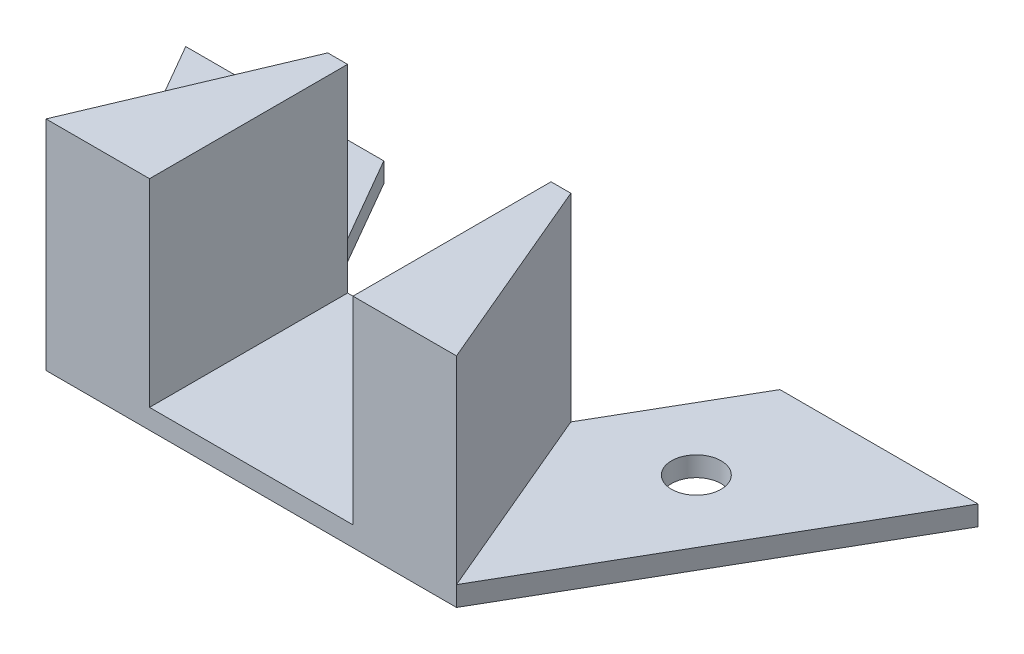
ISO-10303-21;
HEADER;
FILE_DESCRIPTION(('STEP AP214'),'2;1');
FILE_NAME('part.step','',(''),(''),'','','');
FILE_SCHEMA(('AUTOMOTIVE_DESIGN { 1 0 10303 214 1 1 1 1 }'));
ENDSEC;
DATA;
#1=APPLICATION_CONTEXT('core data for automotive mechanical design processes');
#2=APPLICATION_PROTOCOL_DEFINITION('international standard','automotive_design',2000,#1);
#3=PRODUCT_CONTEXT('',#1,'mechanical');
#4=PRODUCT('Part','Part','',(#3));
#5=PRODUCT_RELATED_PRODUCT_CATEGORY('part','',(#4));
#6=PRODUCT_DEFINITION_FORMATION('','',#4);
#7=PRODUCT_DEFINITION_CONTEXT('part definition',#1,'design');
#8=PRODUCT_DEFINITION('design','',#6,#7);
#9=PRODUCT_DEFINITION_SHAPE('','',#8);
#10=(LENGTH_UNIT() NAMED_UNIT(*) SI_UNIT(.MILLI.,.METRE.));
#11=(NAMED_UNIT(*) PLANE_ANGLE_UNIT() SI_UNIT($,.RADIAN.));
#12=(NAMED_UNIT(*) SI_UNIT($,.STERADIAN.) SOLID_ANGLE_UNIT());
#13=UNCERTAINTY_MEASURE_WITH_UNIT(LENGTH_MEASURE(1.E-05),#10,'distance_accuracy_value','');
#14=(GEOMETRIC_REPRESENTATION_CONTEXT(3) GLOBAL_UNCERTAINTY_ASSIGNED_CONTEXT((#13)) GLOBAL_UNIT_ASSIGNED_CONTEXT((#10,
#11,#12)) REPRESENTATION_CONTEXT('',''));
#15=CARTESIAN_POINT('',(0.,0.,0.));
#16=DIRECTION('',(0.,0.,1.));
#17=DIRECTION('',(1.,0.,0.));
#18=AXIS2_PLACEMENT_3D('',#15,#16,#17);
#19=CARTESIAN_POINT('',(0.,2.54,0.));
#20=DIRECTION('',(0.,1.,0.));
#21=DIRECTION('',(0.,0.,1.));
#22=AXIS2_PLACEMENT_3D('',#19,#20,#21);
#23=PLANE('',#22);
#24=DIRECTION('',(-1.,0.,0.));
#25=VECTOR('',#24,1.);
#26=CARTESIAN_POINT('',(0.,2.54,42.4));
#27=LINE('',#26,#25);
#28=CARTESIAN_POINT('',(13.0450454237764,2.54,42.4));
#29=VERTEX_POINT('',#28);
#30=CARTESIAN_POINT('',(-13.0450454237764,2.54,42.4));
#31=VERTEX_POINT('',#30);
#32=EDGE_CURVE('E52',#29,#31,#27,.T.);
#33=ORIENTED_EDGE('',*,*,#32,.F.);
#34=DIRECTION('',(0.,0.,1.));
#35=VECTOR('',#34,1.);
#36=CARTESIAN_POINT('',(13.0450454237764,2.54,17.));
#37=LINE('',#36,#35);
#38=CARTESIAN_POINT('',(13.0450454237764,2.54,17.));
#39=VERTEX_POINT('',#38);
#40=EDGE_CURVE('E224',#39,#29,#37,.T.);
#41=ORIENTED_EDGE('',*,*,#40,.F.);
#42=DIRECTION('',(1.,0.,0.));
#43=VECTOR('',#42,1.);
#44=CARTESIAN_POINT('',(0.,2.54,17.));
#45=LINE('',#44,#43);
#46=CARTESIAN_POINT('',(-13.0450454237764,2.54,17.));
#47=VERTEX_POINT('',#46);
#48=EDGE_CURVE('E143',#47,#39,#45,.T.);
#49=ORIENTED_EDGE('',*,*,#48,.F.);
#50=DIRECTION('',(0.,0.,-1.));
#51=VECTOR('',#50,1.);
#52=CARTESIAN_POINT('',(-13.0450454237764,2.54,17.));
#53=LINE('',#52,#51);
#54=EDGE_CURVE('E123',#31,#47,#53,.T.);
#55=ORIENTED_EDGE('',*,*,#54,.F.);
#56=EDGE_LOOP('',(#33,#41,#49,#55));
#57=FACE_BOUND('',#56,.T.);
#58=ADVANCED_FACE('F37',(#57),#23,.T.);
#59=CARTESIAN_POINT('',(29.526348502534,2.54,14.85));
#60=DIRECTION('',(0.,1.,0.));
#61=DIRECTION('',(0.,0.,1.));
#62=AXIS2_PLACEMENT_3D('',#59,#60,#61);
#63=CIRCLE('',#62,3.17499999999998);
#64=CARTESIAN_POINT('',(29.526348502534,2.54,18.025));
#65=VERTEX_POINT('',#64);
#66=EDGE_CURVE('E484',#65,#65,#63,.T.);
#67=ORIENTED_EDGE('',*,*,#66,.F.);
#68=EDGE_LOOP('',(#67));
#69=FACE_BOUND('',#68,.T.);
#70=DIRECTION('',(0.5,0.,-0.866025403784439));
#71=VECTOR('',#70,1.);
#72=CARTESIAN_POINT('',(19.05,2.54,10.9985226280624));
#73=LINE('',#72,#71);
#74=CARTESIAN_POINT('',(15.5850454237764,2.54,17.));
#75=VERTEX_POINT('',#74);
#76=CARTESIAN_POINT('',(25.4,2.54,0.));
#77=VERTEX_POINT('',#76);
#78=EDGE_CURVE('E168',#75,#77,#73,.T.);
#79=ORIENTED_EDGE('',*,*,#78,.F.);
#80=DIRECTION('',(-0.38930621431251,0.,-0.92110839291457));
#81=VECTOR('',#80,1.);
#82=CARTESIAN_POINT('',(15.5850454237764,2.54,17.));
#83=LINE('',#82,#81);
#84=CARTESIAN_POINT('',(26.3203485863596,2.54,42.4));
#85=VERTEX_POINT('',#84);
#86=EDGE_CURVE('E218',#85,#75,#83,.T.);
#87=ORIENTED_EDGE('',*,*,#86,.F.);
#88=DIRECTION('',(-0.500000000000004,0.,0.866025403784436));
#89=VECTOR('',#88,1.);
#90=CARTESIAN_POINT('',(38.0999999999998,2.54,21.9970452561249));
#91=LINE('',#90,#89);
#92=CARTESIAN_POINT('',(50.8,2.54,0.));
#93=VERTEX_POINT('',#92);
#94=EDGE_CURVE('E162',#93,#85,#91,.T.);
#95=ORIENTED_EDGE('',*,*,#94,.F.);
#96=DIRECTION('',(1.,0.,0.));
#97=VECTOR('',#96,1.);
#98=CARTESIAN_POINT('',(0.,2.54,0.));
#99=LINE('',#98,#97);
#100=EDGE_CURVE('E165',#77,#93,#99,.T.);
#101=ORIENTED_EDGE('',*,*,#100,.F.);
#102=EDGE_LOOP('',(#79,#87,#95,#101));
#103=FACE_BOUND('',#102,.T.);
#104=ADVANCED_FACE('F216',(#69,#103),#23,.T.);
#105=CARTESIAN_POINT('',(-29.5263485025341,2.54,14.85));
#106=DIRECTION('',(0.,1.,0.));
#107=DIRECTION('',(0.,0.,1.));
#108=AXIS2_PLACEMENT_3D('',#105,#106,#107);
#109=CIRCLE('',#108,3.17499999999999);
#110=CARTESIAN_POINT('',(-29.5263485025341,2.54,18.025));
#111=VERTEX_POINT('',#110);
#112=EDGE_CURVE('E486',#111,#111,#109,.T.);
#113=ORIENTED_EDGE('',*,*,#112,.F.);
#114=EDGE_LOOP('',(#113));
#115=FACE_BOUND('',#114,.T.);
#116=DIRECTION('',(-0.389306214312522,0.,0.921108392914565));
#117=VECTOR('',#116,1.);
#118=CARTESIAN_POINT('',(-26.32034858636,2.54,42.4));
#119=LINE('',#118,#117);
#120=CARTESIAN_POINT('',(-15.5850454237764,2.54,17.));
#121=VERTEX_POINT('',#120);
#122=CARTESIAN_POINT('',(-26.32034858636,2.54,42.4));
#123=VERTEX_POINT('',#122);
#124=EDGE_CURVE('E112',#121,#123,#119,.T.);
#125=ORIENTED_EDGE('',*,*,#124,.F.);
#126=DIRECTION('',(0.5,0.,0.866025403784439));
#127=VECTOR('',#126,1.);
#128=CARTESIAN_POINT('',(-19.05,2.54,10.9985226280624));
#129=LINE('',#128,#127);
#130=CARTESIAN_POINT('',(-25.4,2.54,0.));
#131=VERTEX_POINT('',#130);
#132=EDGE_CURVE('E116',#131,#121,#129,.T.);
#133=ORIENTED_EDGE('',*,*,#132,.F.);
#134=DIRECTION('',(-1.,0.,0.));
#135=VECTOR('',#134,1.);
#136=CARTESIAN_POINT('',(0.,2.54,0.));
#137=LINE('',#136,#135);
#138=CARTESIAN_POINT('',(-50.8,2.54,0.));
#139=VERTEX_POINT('',#138);
#140=EDGE_CURVE('E61',#131,#139,#137,.T.);
#141=ORIENTED_EDGE('',*,*,#140,.T.);
#142=DIRECTION('',(-0.499999999999998,0.,-0.86602540378444));
#143=VECTOR('',#142,1.);
#144=CARTESIAN_POINT('',(-38.1000000000001,2.54,21.9970452561247));
#145=LINE('',#144,#143);
#146=EDGE_CURVE('E117',#123,#139,#145,.T.);
#147=ORIENTED_EDGE('',*,*,#146,.F.);
#148=EDGE_LOOP('',(#125,#133,#141,#147));
#149=FACE_BOUND('',#148,.T.);
#150=ADVANCED_FACE('F114',(#115,#149),#23,.T.);
#151=CARTESIAN_POINT('',(-38.1000000000001,2.54,21.9970452561247));
#152=DIRECTION('',(-0.86602540378444,0.,0.499999999999998));
#153=DIRECTION('',(0.499999999999998,0.,0.86602540378444));
#154=AXIS2_PLACEMENT_3D('',#151,#152,#153);
#155=PLANE('',#154);
#156=DIRECTION('',(-0.499999999999998,0.,-0.86602540378444));
#157=VECTOR('',#156,1.);
#158=CARTESIAN_POINT('',(-38.1000000000001,0.,21.9970452561247));
#159=LINE('',#158,#157);
#160=CARTESIAN_POINT('',(-26.32034858636,0.,42.4));
#161=VERTEX_POINT('',#160);
#162=CARTESIAN_POINT('',(-50.8,0.,0.));
#163=VERTEX_POINT('',#162);
#164=EDGE_CURVE('E158',#161,#163,#159,.T.);
#165=ORIENTED_EDGE('',*,*,#164,.F.);
#166=DIRECTION('',(0.,-1.,0.));
#167=VECTOR('',#166,1.);
#168=CARTESIAN_POINT('',(-26.32034858636,2.54,42.4));
#169=LINE('',#168,#167);
#170=EDGE_CURVE('E11',#123,#161,#169,.T.);
#171=ORIENTED_EDGE('',*,*,#170,.F.);
#172=ORIENTED_EDGE('',*,*,#146,.T.);
#173=DIRECTION('',(0.,-1.,0.));
#174=VECTOR('',#173,1.);
#175=CARTESIAN_POINT('',(-50.8,2.54,0.));
#176=LINE('',#175,#174);
#177=EDGE_CURVE('E94',#139,#163,#176,.T.);
#178=ORIENTED_EDGE('',*,*,#177,.T.);
#179=EDGE_LOOP('',(#165,#171,#172,#178));
#180=FACE_BOUND('',#179,.T.);
#181=ADVANCED_FACE('F39',(#180),#155,.T.);
#182=CARTESIAN_POINT('',(0.,2.54,42.4));
#183=DIRECTION('',(0.,0.,1.));
#184=DIRECTION('',(1.,0.,0.));
#185=AXIS2_PLACEMENT_3D('',#182,#183,#184);
#186=PLANE('',#185);
#187=DIRECTION('',(-1.,0.,0.));
#188=VECTOR('',#187,1.);
#189=CARTESIAN_POINT('',(0.,0.,42.4));
#190=LINE('',#189,#188);
#191=CARTESIAN_POINT('',(26.3203485863596,0.,42.4));
#192=VERTEX_POINT('',#191);
#193=EDGE_CURVE('E176',#192,#161,#190,.T.);
#194=ORIENTED_EDGE('',*,*,#193,.F.);
#195=DIRECTION('',(0.,-1.,0.));
#196=VECTOR('',#195,1.);
#197=CARTESIAN_POINT('',(26.3203485863596,2.54,42.4));
#198=LINE('',#197,#196);
#199=EDGE_CURVE('E45',#85,#192,#198,.T.);
#200=ORIENTED_EDGE('',*,*,#199,.F.);
#201=DIRECTION('',(0.,-1.,0.));
#202=VECTOR('',#201,1.);
#203=CARTESIAN_POINT('',(26.3203485863596,27.94,42.4));
#204=LINE('',#203,#202);
#205=CARTESIAN_POINT('',(26.3203485863596,27.94,42.4));
#206=VERTEX_POINT('',#205);
#207=EDGE_CURVE('E236',#206,#85,#204,.T.);
#208=ORIENTED_EDGE('',*,*,#207,.F.);
#209=DIRECTION('',(1.,0.,0.));
#210=VECTOR('',#209,1.);
#211=CARTESIAN_POINT('',(13.0450454237764,27.94,42.4));
#212=LINE('',#211,#210);
#213=CARTESIAN_POINT('',(13.0450454237764,27.94,42.4));
#214=VERTEX_POINT('',#213);
#215=EDGE_CURVE('E291',#214,#206,#212,.T.);
#216=ORIENTED_EDGE('',*,*,#215,.F.);
#217=DIRECTION('',(0.,-1.,0.));
#218=VECTOR('',#217,1.);
#219=CARTESIAN_POINT('',(13.0450454237764,27.94,42.4));
#220=LINE('',#219,#218);
#221=EDGE_CURVE('E239',#214,#29,#220,.T.);
#222=ORIENTED_EDGE('',*,*,#221,.T.);
#223=ORIENTED_EDGE('',*,*,#32,.T.);
#224=DIRECTION('',(0.,-1.,0.));
#225=VECTOR('',#224,1.);
#226=CARTESIAN_POINT('',(-13.0450454237764,27.94,42.4));
#227=LINE('',#226,#225);
#228=CARTESIAN_POINT('',(-13.0450454237764,27.94,42.4));
#229=VERTEX_POINT('',#228);
#230=EDGE_CURVE('E152',#229,#31,#227,.T.);
#231=ORIENTED_EDGE('',*,*,#230,.F.);
#232=DIRECTION('',(1.,0.,0.));
#233=VECTOR('',#232,1.);
#234=CARTESIAN_POINT('',(-13.0450454237764,27.94,42.4));
#235=LINE('',#234,#233);
#236=CARTESIAN_POINT('',(-26.32034858636,27.94,42.4));
#237=VERTEX_POINT('',#236);
#238=EDGE_CURVE('E122',#237,#229,#235,.T.);
#239=ORIENTED_EDGE('',*,*,#238,.F.);
#240=DIRECTION('',(0.,-1.,0.));
#241=VECTOR('',#240,1.);
#242=CARTESIAN_POINT('',(-26.32034858636,27.94,42.4));
#243=LINE('',#242,#241);
#244=EDGE_CURVE('E149',#237,#123,#243,.T.);
#245=ORIENTED_EDGE('',*,*,#244,.T.);
#246=ORIENTED_EDGE('',*,*,#170,.T.);
#247=EDGE_LOOP('',(#194,#200,#208,#216,#222,#223,#231,#239,#245,#246));
#248=FACE_BOUND('',#247,.T.);
#249=ADVANCED_FACE('F205',(#248),#186,.T.);
#250=CARTESIAN_POINT('',(38.0999999999998,2.54,21.9970452561249));
#251=DIRECTION('',(0.866025403784436,0.,0.500000000000004));
#252=DIRECTION('',(0.500000000000004,0.,-0.866025403784436));
#253=AXIS2_PLACEMENT_3D('',#250,#251,#252);
#254=PLANE('',#253);
#255=DIRECTION('',(-0.500000000000004,0.,0.866025403784436));
#256=VECTOR('',#255,1.);
#257=CARTESIAN_POINT('',(38.0999999999998,0.,21.9970452561249));
#258=LINE('',#257,#256);
#259=CARTESIAN_POINT('',(50.8,0.,0.));
#260=VERTEX_POINT('',#259);
#261=EDGE_CURVE('E179',#260,#192,#258,.T.);
#262=ORIENTED_EDGE('',*,*,#261,.F.);
#263=DIRECTION('',(0.,-1.,0.));
#264=VECTOR('',#263,1.);
#265=CARTESIAN_POINT('',(50.8,2.54,0.));
#266=LINE('',#265,#264);
#267=EDGE_CURVE('E197',#93,#260,#266,.T.);
#268=ORIENTED_EDGE('',*,*,#267,.F.);
#269=ORIENTED_EDGE('',*,*,#94,.T.);
#270=ORIENTED_EDGE('',*,*,#199,.T.);
#271=EDGE_LOOP('',(#262,#268,#269,#270));
#272=FACE_BOUND('',#271,.T.);
#273=ADVANCED_FACE('F202',(#272),#254,.T.);
#274=CARTESIAN_POINT('',(0.,2.54,0.));
#275=DIRECTION('',(0.,0.,-1.));
#276=DIRECTION('',(-1.,0.,0.));
#277=AXIS2_PLACEMENT_3D('',#274,#275,#276);
#278=PLANE('',#277);
#279=DIRECTION('',(1.,0.,0.));
#280=VECTOR('',#279,1.);
#281=CARTESIAN_POINT('',(0.,0.,0.));
#282=LINE('',#281,#280);
#283=CARTESIAN_POINT('',(25.4,0.,0.));
#284=VERTEX_POINT('',#283);
#285=EDGE_CURVE('E182',#284,#260,#282,.T.);
#286=ORIENTED_EDGE('',*,*,#285,.F.);
#287=DIRECTION('',(0.,-1.,0.));
#288=VECTOR('',#287,1.);
#289=CARTESIAN_POINT('',(25.4,2.54,0.));
#290=LINE('',#289,#288);
#291=EDGE_CURVE('E195',#77,#284,#290,.T.);
#292=ORIENTED_EDGE('',*,*,#291,.F.);
#293=ORIENTED_EDGE('',*,*,#100,.T.);
#294=ORIENTED_EDGE('',*,*,#267,.T.);
#295=EDGE_LOOP('',(#286,#292,#293,#294));
#296=FACE_BOUND('',#295,.T.);
#297=ADVANCED_FACE('F211',(#296),#278,.T.);
#298=CARTESIAN_POINT('',(19.05,2.54,10.9985226280624));
#299=DIRECTION('',(-0.866025403784439,0.,-0.499999999999999));
#300=DIRECTION('',(-0.5,0.,0.866025403784439));
#301=AXIS2_PLACEMENT_3D('',#298,#299,#300);
#302=PLANE('',#301);
#303=DIRECTION('',(0.5,0.,-0.866025403784439));
#304=VECTOR('',#303,1.);
#305=CARTESIAN_POINT('',(19.05,0.,10.9985226280624));
#306=LINE('',#305,#304);
#307=CARTESIAN_POINT('',(15.5850454237764,0.,17.));
#308=VERTEX_POINT('',#307);
#309=EDGE_CURVE('E185',#308,#284,#306,.T.);
#310=ORIENTED_EDGE('',*,*,#309,.F.);
#311=DIRECTION('',(0.,-1.,0.));
#312=VECTOR('',#311,1.);
#313=CARTESIAN_POINT('',(15.5850454237764,2.54,17.));
#314=LINE('',#313,#312);
#315=EDGE_CURVE('E139',#75,#308,#314,.T.);
#316=ORIENTED_EDGE('',*,*,#315,.F.);
#317=ORIENTED_EDGE('',*,*,#78,.T.);
#318=ORIENTED_EDGE('',*,*,#291,.T.);
#319=EDGE_LOOP('',(#310,#316,#317,#318));
#320=FACE_BOUND('',#319,.T.);
#321=ADVANCED_FACE('F298',(#320),#302,.T.);
#322=CARTESIAN_POINT('',(0.,2.54,17.));
#323=DIRECTION('',(0.,0.,-1.));
#324=DIRECTION('',(-1.,0.,0.));
#325=AXIS2_PLACEMENT_3D('',#322,#323,#324);
#326=PLANE('',#325);
#327=DIRECTION('',(1.,0.,0.));
#328=VECTOR('',#327,1.);
#329=CARTESIAN_POINT('',(0.,0.,17.));
#330=LINE('',#329,#328);
#331=CARTESIAN_POINT('',(-15.5850454237764,0.,17.));
#332=VERTEX_POINT('',#331);
#333=EDGE_CURVE('E135',#332,#308,#330,.T.);
#334=ORIENTED_EDGE('',*,*,#333,.F.);
#335=DIRECTION('',(0.,-1.,0.));
#336=VECTOR('',#335,1.);
#337=CARTESIAN_POINT('',(-15.5850454237764,2.54,17.));
#338=LINE('',#337,#336);
#339=EDGE_CURVE('E128',#121,#332,#338,.T.);
#340=ORIENTED_EDGE('',*,*,#339,.F.);
#341=DIRECTION('',(0.,-1.,0.));
#342=VECTOR('',#341,1.);
#343=CARTESIAN_POINT('',(-15.5850454237764,27.94,17.));
#344=LINE('',#343,#342);
#345=CARTESIAN_POINT('',(-15.5850454237764,27.94,17.));
#346=VERTEX_POINT('',#345);
#347=EDGE_CURVE('E132',#346,#121,#344,.T.);
#348=ORIENTED_EDGE('',*,*,#347,.F.);
#349=DIRECTION('',(-1.,0.,0.));
#350=VECTOR('',#349,1.);
#351=CARTESIAN_POINT('',(-13.0450454237764,27.94,17.));
#352=LINE('',#351,#350);
#353=CARTESIAN_POINT('',(-13.0450454237764,27.94,17.));
#354=VERTEX_POINT('',#353);
#355=EDGE_CURVE('E249',#354,#346,#352,.T.);
#356=ORIENTED_EDGE('',*,*,#355,.F.);
#357=DIRECTION('',(0.,-1.,0.));
#358=VECTOR('',#357,1.);
#359=CARTESIAN_POINT('',(-13.0450454237764,27.94,17.));
#360=LINE('',#359,#358);
#361=EDGE_CURVE('E148',#354,#47,#360,.T.);
#362=ORIENTED_EDGE('',*,*,#361,.T.);
#363=ORIENTED_EDGE('',*,*,#48,.T.);
#364=DIRECTION('',(0.,-1.,0.));
#365=VECTOR('',#364,1.);
#366=CARTESIAN_POINT('',(13.0450454237764,27.94,17.));
#367=LINE('',#366,#365);
#368=CARTESIAN_POINT('',(13.0450454237764,27.94,17.));
#369=VERTEX_POINT('',#368);
#370=EDGE_CURVE('E241',#369,#39,#367,.T.);
#371=ORIENTED_EDGE('',*,*,#370,.F.);
#372=DIRECTION('',(-1.,0.,0.));
#373=VECTOR('',#372,1.);
#374=CARTESIAN_POINT('',(15.5850454237764,27.94,17.));
#375=LINE('',#374,#373);
#376=CARTESIAN_POINT('',(15.5850454237764,27.94,17.));
#377=VERTEX_POINT('',#376);
#378=EDGE_CURVE('E223',#377,#369,#375,.T.);
#379=ORIENTED_EDGE('',*,*,#378,.F.);
#380=DIRECTION('',(0.,-1.,0.));
#381=VECTOR('',#380,1.);
#382=CARTESIAN_POINT('',(15.5850454237764,27.94,17.));
#383=LINE('',#382,#381);
#384=EDGE_CURVE('E234',#377,#75,#383,.T.);
#385=ORIENTED_EDGE('',*,*,#384,.T.);
#386=ORIENTED_EDGE('',*,*,#315,.T.);
#387=EDGE_LOOP('',(#334,#340,#348,#356,#362,#363,#371,#379,#385,#386));
#388=FACE_BOUND('',#387,.T.);
#389=ADVANCED_FACE('F129',(#388),#326,.T.);
#390=CARTESIAN_POINT('',(-19.05,2.54,10.9985226280624));
#391=DIRECTION('',(0.866025403784439,0.,-0.5));
#392=DIRECTION('',(-0.5,0.,-0.866025403784439));
#393=AXIS2_PLACEMENT_3D('',#390,#391,#392);
#394=PLANE('',#393);
#395=DIRECTION('',(0.5,0.,0.866025403784439));
#396=VECTOR('',#395,1.);
#397=CARTESIAN_POINT('',(-19.05,0.,10.9985226280624));
#398=LINE('',#397,#396);
#399=CARTESIAN_POINT('',(-25.4,0.,0.));
#400=VERTEX_POINT('',#399);
#401=EDGE_CURVE('E189',#400,#332,#398,.T.);
#402=ORIENTED_EDGE('',*,*,#401,.F.);
#403=DIRECTION('',(0.,-1.,0.));
#404=VECTOR('',#403,1.);
#405=CARTESIAN_POINT('',(-25.4,2.54,0.));
#406=LINE('',#405,#404);
#407=EDGE_CURVE('E140',#131,#400,#406,.T.);
#408=ORIENTED_EDGE('',*,*,#407,.F.);
#409=ORIENTED_EDGE('',*,*,#132,.T.);
#410=ORIENTED_EDGE('',*,*,#339,.T.);
#411=EDGE_LOOP('',(#402,#408,#409,#410));
#412=FACE_BOUND('',#411,.T.);
#413=ADVANCED_FACE('F142',(#412),#394,.T.);
#414=CARTESIAN_POINT('',(0.,2.54,0.));
#415=DIRECTION('',(0.,0.,1.));
#416=DIRECTION('',(1.,0.,0.));
#417=AXIS2_PLACEMENT_3D('',#414,#415,#416);
#418=PLANE('',#417);
#419=DIRECTION('',(-1.,0.,0.));
#420=VECTOR('',#419,1.);
#421=CARTESIAN_POINT('',(0.,0.,0.));
#422=LINE('',#421,#420);
#423=EDGE_CURVE('E160',#400,#163,#422,.T.);
#424=ORIENTED_EDGE('',*,*,#423,.T.);
#425=ORIENTED_EDGE('',*,*,#177,.F.);
#426=ORIENTED_EDGE('',*,*,#140,.F.);
#427=ORIENTED_EDGE('',*,*,#407,.T.);
#428=EDGE_LOOP('',(#424,#425,#426,#427));
#429=FACE_BOUND('',#428,.T.);
#430=ADVANCED_FACE('F301',(#429),#418,.F.);
#431=CARTESIAN_POINT('',(0.,0.,0.));
#432=DIRECTION('',(0.,1.,0.));
#433=DIRECTION('',(0.,0.,1.));
#434=AXIS2_PLACEMENT_3D('',#431,#432,#433);
#435=PLANE('',#434);
#436=CARTESIAN_POINT('',(29.526348502534,0.,14.85));
#437=DIRECTION('',(0.,1.,0.));
#438=DIRECTION('',(0.,0.,1.));
#439=AXIS2_PLACEMENT_3D('',#436,#437,#438);
#440=CIRCLE('',#439,3.17499999999999);
#441=CARTESIAN_POINT('',(29.526348502534,0.,18.025));
#442=VERTEX_POINT('',#441);
#443=EDGE_CURVE('E481',#442,#442,#440,.T.);
#444=ORIENTED_EDGE('',*,*,#443,.T.);
#445=EDGE_LOOP('',(#444));
#446=FACE_BOUND('',#445,.T.);
#447=CARTESIAN_POINT('',(-29.5263485025341,0.,14.85));
#448=DIRECTION('',(0.,1.,0.));
#449=DIRECTION('',(0.,0.,1.));
#450=AXIS2_PLACEMENT_3D('',#447,#448,#449);
#451=CIRCLE('',#450,3.17499999999999);
#452=CARTESIAN_POINT('',(-29.5263485025341,0.,18.025));
#453=VERTEX_POINT('',#452);
#454=EDGE_CURVE('E230',#453,#453,#451,.T.);
#455=ORIENTED_EDGE('',*,*,#454,.T.);
#456=EDGE_LOOP('',(#455));
#457=FACE_BOUND('',#456,.T.);
#458=ORIENTED_EDGE('',*,*,#164,.T.);
#459=ORIENTED_EDGE('',*,*,#423,.F.);
#460=ORIENTED_EDGE('',*,*,#401,.T.);
#461=ORIENTED_EDGE('',*,*,#333,.T.);
#462=ORIENTED_EDGE('',*,*,#309,.T.);
#463=ORIENTED_EDGE('',*,*,#285,.T.);
#464=ORIENTED_EDGE('',*,*,#261,.T.);
#465=ORIENTED_EDGE('',*,*,#193,.T.);
#466=EDGE_LOOP('',(#458,#459,#460,#461,#462,#463,#464,#465));
#467=FACE_BOUND('',#466,.T.);
#468=ADVANCED_FACE('F207',(#446,#457,#467),#435,.F.);
#469=CARTESIAN_POINT('',(-13.0450454237764,27.94,17.));
#470=DIRECTION('',(-1.,0.,0.));
#471=DIRECTION('',(0.,0.,1.));
#472=AXIS2_PLACEMENT_3D('',#469,#470,#471);
#473=PLANE('',#472);
#474=ORIENTED_EDGE('',*,*,#54,.T.);
#475=ORIENTED_EDGE('',*,*,#361,.F.);
#476=DIRECTION('',(0.,0.,-1.));
#477=VECTOR('',#476,1.);
#478=CARTESIAN_POINT('',(-13.0450454237764,27.94,17.));
#479=LINE('',#478,#477);
#480=EDGE_CURVE('E246',#229,#354,#479,.T.);
#481=ORIENTED_EDGE('',*,*,#480,.F.);
#482=ORIENTED_EDGE('',*,*,#230,.T.);
#483=EDGE_LOOP('',(#474,#475,#481,#482));
#484=FACE_BOUND('',#483,.T.);
#485=ADVANCED_FACE('F256',(#484),#473,.F.);
#486=CARTESIAN_POINT('',(-26.32034858636,27.94,42.4));
#487=DIRECTION('',(0.921108392914565,0.,0.389306214312522));
#488=DIRECTION('',(0.389306214312522,0.,-0.921108392914565));
#489=AXIS2_PLACEMENT_3D('',#486,#487,#488);
#490=PLANE('',#489);
#491=ORIENTED_EDGE('',*,*,#124,.T.);
#492=ORIENTED_EDGE('',*,*,#244,.F.);
#493=DIRECTION('',(-0.389306214312522,0.,0.921108392914565));
#494=VECTOR('',#493,1.);
#495=CARTESIAN_POINT('',(-26.32034858636,27.94,42.4));
#496=LINE('',#495,#494);
#497=EDGE_CURVE('E147',#346,#237,#496,.T.);
#498=ORIENTED_EDGE('',*,*,#497,.F.);
#499=ORIENTED_EDGE('',*,*,#347,.T.);
#500=EDGE_LOOP('',(#491,#492,#498,#499));
#501=FACE_BOUND('',#500,.T.);
#502=ADVANCED_FACE('F145',(#501),#490,.F.);
#503=CARTESIAN_POINT('',(0.,27.94,0.));
#504=DIRECTION('',(0.,1.,0.));
#505=DIRECTION('',(0.,0.,1.));
#506=AXIS2_PLACEMENT_3D('',#503,#504,#505);
#507=PLANE('',#506);
#508=ORIENTED_EDGE('',*,*,#238,.T.);
#509=ORIENTED_EDGE('',*,*,#480,.T.);
#510=ORIENTED_EDGE('',*,*,#355,.T.);
#511=ORIENTED_EDGE('',*,*,#497,.T.);
#512=EDGE_LOOP('',(#508,#509,#510,#511));
#513=FACE_BOUND('',#512,.T.);
#514=ADVANCED_FACE('F267',(#513),#507,.T.);
#515=CARTESIAN_POINT('',(13.0450454237764,27.94,17.));
#516=DIRECTION('',(1.,0.,0.));
#517=DIRECTION('',(0.,0.,-1.));
#518=AXIS2_PLACEMENT_3D('',#515,#516,#517);
#519=PLANE('',#518);
#520=ORIENTED_EDGE('',*,*,#40,.T.);
#521=ORIENTED_EDGE('',*,*,#221,.F.);
#522=DIRECTION('',(0.,0.,1.));
#523=VECTOR('',#522,1.);
#524=CARTESIAN_POINT('',(13.0450454237764,27.94,17.));
#525=LINE('',#524,#523);
#526=EDGE_CURVE('E227',#369,#214,#525,.T.);
#527=ORIENTED_EDGE('',*,*,#526,.F.);
#528=ORIENTED_EDGE('',*,*,#370,.T.);
#529=EDGE_LOOP('',(#520,#521,#527,#528));
#530=FACE_BOUND('',#529,.T.);
#531=ADVANCED_FACE('F287',(#530),#519,.F.);
#532=CARTESIAN_POINT('',(15.5850454237764,27.94,17.));
#533=DIRECTION('',(-0.92110839291457,0.,0.38930621431251));
#534=DIRECTION('',(0.38930621431251,0.,0.92110839291457));
#535=AXIS2_PLACEMENT_3D('',#532,#533,#534);
#536=PLANE('',#535);
#537=ORIENTED_EDGE('',*,*,#86,.T.);
#538=ORIENTED_EDGE('',*,*,#384,.F.);
#539=DIRECTION('',(-0.38930621431251,0.,-0.92110839291457));
#540=VECTOR('',#539,1.);
#541=CARTESIAN_POINT('',(15.5850454237764,27.94,17.));
#542=LINE('',#541,#540);
#543=EDGE_CURVE('E237',#206,#377,#542,.T.);
#544=ORIENTED_EDGE('',*,*,#543,.F.);
#545=ORIENTED_EDGE('',*,*,#207,.T.);
#546=EDGE_LOOP('',(#537,#538,#544,#545));
#547=FACE_BOUND('',#546,.T.);
#548=ADVANCED_FACE('F383',(#547),#536,.F.);
#549=CARTESIAN_POINT('',(0.,27.94,0.));
#550=DIRECTION('',(0.,1.,0.));
#551=DIRECTION('',(0.,0.,1.));
#552=AXIS2_PLACEMENT_3D('',#549,#550,#551);
#553=PLANE('',#552);
#554=ORIENTED_EDGE('',*,*,#378,.T.);
#555=ORIENTED_EDGE('',*,*,#526,.T.);
#556=ORIENTED_EDGE('',*,*,#215,.T.);
#557=ORIENTED_EDGE('',*,*,#543,.T.);
#558=EDGE_LOOP('',(#554,#555,#556,#557));
#559=FACE_BOUND('',#558,.T.);
#560=ADVANCED_FACE('F294',(#559),#553,.T.);
#561=CARTESIAN_POINT('',(-29.5263485025341,2.54,14.85));
#562=DIRECTION('',(0.,1.,0.));
#563=DIRECTION('',(0.,0.,1.));
#564=AXIS2_PLACEMENT_3D('',#561,#562,#563);
#565=CYLINDRICAL_SURFACE('',#564,3.17499999999999);
#566=ORIENTED_EDGE('',*,*,#454,.F.);
#567=EDGE_LOOP('',(#566));
#568=FACE_BOUND('',#567,.T.);
#569=ORIENTED_EDGE('',*,*,#112,.T.);
#570=EDGE_LOOP('',(#569));
#571=FACE_BOUND('',#570,.T.);
#572=ADVANCED_FACE('F396',(#568,#571),#565,.F.);
#573=CARTESIAN_POINT('',(29.526348502534,2.54,14.85));
#574=DIRECTION('',(0.,1.,0.));
#575=DIRECTION('',(0.,0.,1.));
#576=AXIS2_PLACEMENT_3D('',#573,#574,#575);
#577=CYLINDRICAL_SURFACE('',#576,3.17499999999999);
#578=ORIENTED_EDGE('',*,*,#443,.F.);
#579=EDGE_LOOP('',(#578));
#580=FACE_BOUND('',#579,.T.);
#581=ORIENTED_EDGE('',*,*,#66,.T.);
#582=EDGE_LOOP('',(#581));
#583=FACE_BOUND('',#582,.T.);
#584=ADVANCED_FACE('F403',(#580,#583),#577,.F.);
#585=CLOSED_SHELL('',(#58,#104,#150,#181,#249,#273,#297,#321,#389,#413,#430,#468,#485,#502,#514,
#531,#548,#560,#572,#584));
#586=MANIFOLD_SOLID_BREP('B2',#585);
#587=ADVANCED_BREP_SHAPE_REPRESENTATION('',(#18,#586),#14);
#588=SHAPE_DEFINITION_REPRESENTATION(#9,#587);
ENDSEC;
END-ISO-10303-21;
